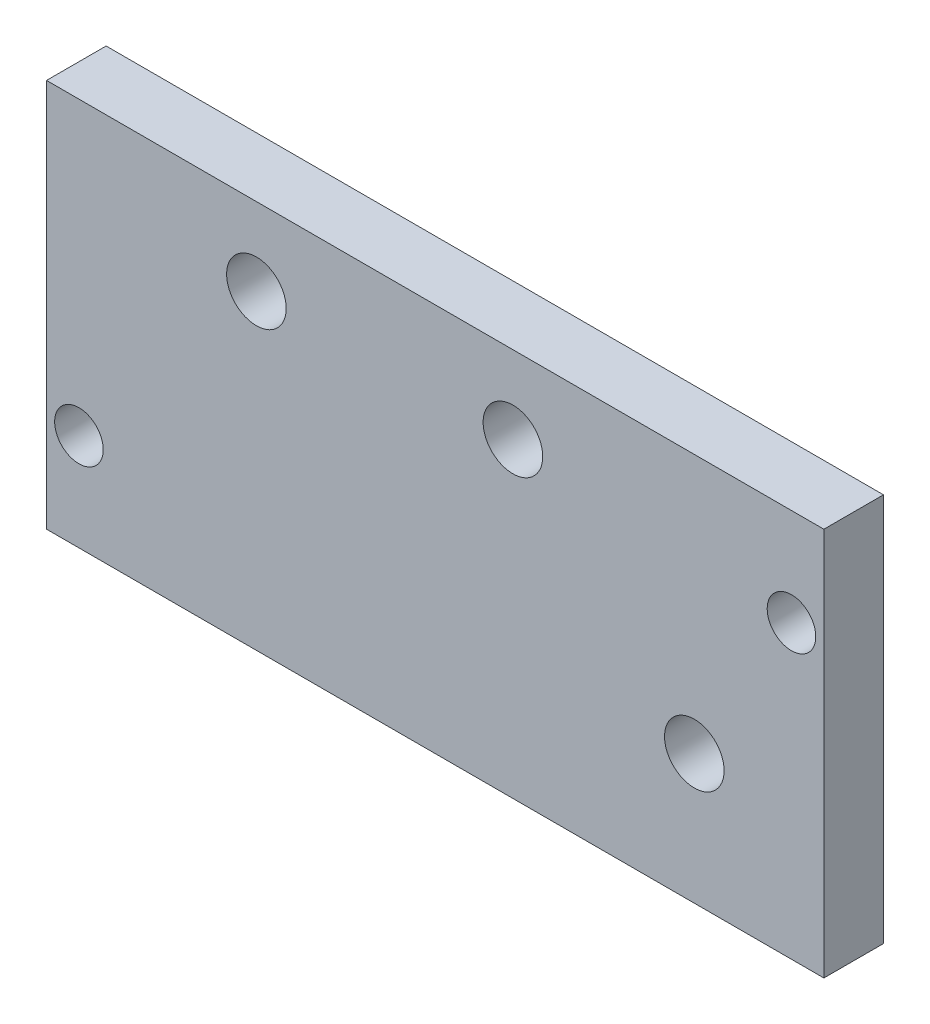
ISO-10303-21;
HEADER;
FILE_DESCRIPTION(('STEP AP214'),'2;1');
FILE_NAME('part.step','',(''),(''),'','','');
FILE_SCHEMA(('AUTOMOTIVE_DESIGN { 1 0 10303 214 1 1 1 1 }'));
ENDSEC;
DATA;
#1=APPLICATION_CONTEXT('core data for automotive mechanical design processes');
#2=APPLICATION_PROTOCOL_DEFINITION('international standard','automotive_design',2000,#1);
#3=PRODUCT_CONTEXT('',#1,'mechanical');
#4=PRODUCT('Part','Part','',(#3));
#5=PRODUCT_RELATED_PRODUCT_CATEGORY('part','',(#4));
#6=PRODUCT_DEFINITION_FORMATION('','',#4);
#7=PRODUCT_DEFINITION_CONTEXT('part definition',#1,'design');
#8=PRODUCT_DEFINITION('design','',#6,#7);
#9=PRODUCT_DEFINITION_SHAPE('','',#8);
#10=(LENGTH_UNIT() NAMED_UNIT(*) SI_UNIT(.MILLI.,.METRE.));
#11=(NAMED_UNIT(*) PLANE_ANGLE_UNIT() SI_UNIT($,.RADIAN.));
#12=(NAMED_UNIT(*) SI_UNIT($,.STERADIAN.) SOLID_ANGLE_UNIT());
#13=UNCERTAINTY_MEASURE_WITH_UNIT(LENGTH_MEASURE(1.E-05),#10,'distance_accuracy_value','');
#14=(GEOMETRIC_REPRESENTATION_CONTEXT(3) GLOBAL_UNCERTAINTY_ASSIGNED_CONTEXT((#13)) GLOBAL_UNIT_ASSIGNED_CONTEXT((#10,
#11,#12)) REPRESENTATION_CONTEXT('',''));
#15=CARTESIAN_POINT('',(0.,0.,0.));
#16=DIRECTION('',(0.,0.,1.));
#17=DIRECTION('',(1.,0.,0.));
#18=AXIS2_PLACEMENT_3D('',#15,#16,#17);
#19=CARTESIAN_POINT('',(0.,0.,4.6));
#20=DIRECTION('',(0.,0.,-1.));
#21=DIRECTION('',(-1.,0.,0.));
#22=AXIS2_PLACEMENT_3D('',#19,#20,#21);
#23=PLANE('',#22);
#24=CARTESIAN_POINT('',(-27.5,-7.5,4.6));
#25=DIRECTION('',(0.,0.,-1.));
#26=DIRECTION('',(-1.,0.,0.));
#27=AXIS2_PLACEMENT_3D('',#24,#25,#26);
#28=CIRCLE('',#27,1.875);
#29=CARTESIAN_POINT('',(-29.375,-7.5,4.6));
#30=VERTEX_POINT('',#29);
#31=EDGE_CURVE('E133',#30,#30,#28,.F.);
#32=ORIENTED_EDGE('',*,*,#31,.F.);
#33=EDGE_LOOP('',(#32));
#34=FACE_BOUND('',#33,.T.);
#35=CARTESIAN_POINT('',(27.5,7.5,4.6));
#36=DIRECTION('',(0.,0.,-1.));
#37=DIRECTION('',(-1.,0.,0.));
#38=AXIS2_PLACEMENT_3D('',#35,#36,#37);
#39=CIRCLE('',#38,1.875);
#40=CARTESIAN_POINT('',(25.625,7.5,4.6));
#41=VERTEX_POINT('',#40);
#42=EDGE_CURVE('E138',#41,#41,#39,.F.);
#43=ORIENTED_EDGE('',*,*,#42,.F.);
#44=EDGE_LOOP('',(#43));
#45=FACE_BOUND('',#44,.T.);
#46=DIRECTION('',(0.,1.,0.));
#47=VECTOR('',#46,1.);
#48=CARTESIAN_POINT('',(30.,-15.,4.6));
#49=LINE('',#48,#47);
#50=CARTESIAN_POINT('',(30.,-15.,4.6));
#51=VERTEX_POINT('',#50);
#52=CARTESIAN_POINT('',(30.,15.,4.6));
#53=VERTEX_POINT('',#52);
#54=EDGE_CURVE('E91',#51,#53,#49,.T.);
#55=ORIENTED_EDGE('',*,*,#54,.T.);
#56=DIRECTION('',(-1.,0.,0.));
#57=VECTOR('',#56,1.);
#58=CARTESIAN_POINT('',(-30.,15.,4.6));
#59=LINE('',#58,#57);
#60=CARTESIAN_POINT('',(-30.,15.,4.6));
#61=VERTEX_POINT('',#60);
#62=EDGE_CURVE('E86',#53,#61,#59,.T.);
#63=ORIENTED_EDGE('',*,*,#62,.T.);
#64=DIRECTION('',(0.,-1.,0.));
#65=VECTOR('',#64,1.);
#66=CARTESIAN_POINT('',(-30.,-15.,4.6));
#67=LINE('',#66,#65);
#68=CARTESIAN_POINT('',(-30.,-15.,4.6));
#69=VERTEX_POINT('',#68);
#70=EDGE_CURVE('E89',#61,#69,#67,.T.);
#71=ORIENTED_EDGE('',*,*,#70,.T.);
#72=DIRECTION('',(1.,0.,0.));
#73=VECTOR('',#72,1.);
#74=CARTESIAN_POINT('',(-30.,-15.,4.6));
#75=LINE('',#74,#73);
#76=EDGE_CURVE('E56',#69,#51,#75,.T.);
#77=ORIENTED_EDGE('',*,*,#76,.T.);
#78=EDGE_LOOP('',(#55,#63,#71,#77));
#79=FACE_BOUND('',#78,.T.);
#80=CARTESIAN_POINT('',(-13.8007142674936,9.00071426749366,4.6));
#81=DIRECTION('',(0.,0.,1.));
#82=DIRECTION('',(1.,0.,0.));
#83=AXIS2_PLACEMENT_3D('',#80,#81,#82);
#84=CIRCLE('',#83,2.3);
#85=CARTESIAN_POINT('',(-11.5007142674936,9.00071426749366,4.6));
#86=VERTEX_POINT('',#85);
#87=EDGE_CURVE('E106',#86,#86,#84,.T.);
#88=ORIENTED_EDGE('',*,*,#87,.F.);
#89=EDGE_LOOP('',(#88));
#90=FACE_BOUND('',#89,.T.);
#91=CARTESIAN_POINT('',(5.99928573250638,9.00071426749366,4.6));
#92=DIRECTION('',(0.,0.,1.));
#93=DIRECTION('',(1.,0.,0.));
#94=AXIS2_PLACEMENT_3D('',#91,#92,#93);
#95=CIRCLE('',#94,2.3);
#96=CARTESIAN_POINT('',(8.29928573250638,9.00071426749366,4.6));
#97=VERTEX_POINT('',#96);
#98=EDGE_CURVE('E121',#97,#97,#95,.T.);
#99=ORIENTED_EDGE('',*,*,#98,.F.);
#100=EDGE_LOOP('',(#99));
#101=FACE_BOUND('',#100,.T.);
#102=CARTESIAN_POINT('',(20.,-5.,4.6));
#103=DIRECTION('',(0.,0.,1.));
#104=DIRECTION('',(1.,0.,0.));
#105=AXIS2_PLACEMENT_3D('',#102,#103,#104);
#106=CIRCLE('',#105,2.3);
#107=CARTESIAN_POINT('',(22.3,-5.,4.6));
#108=VERTEX_POINT('',#107);
#109=EDGE_CURVE('E127',#108,#108,#106,.T.);
#110=ORIENTED_EDGE('',*,*,#109,.F.);
#111=EDGE_LOOP('',(#110));
#112=FACE_BOUND('',#111,.T.);
#113=ADVANCED_FACE('F39',(#34,#45,#79,#90,#101,#112),#23,.F.);
#114=CARTESIAN_POINT('',(0.,0.,0.));
#115=DIRECTION('',(0.,0.,-1.));
#116=DIRECTION('',(-1.,0.,0.));
#117=AXIS2_PLACEMENT_3D('',#114,#115,#116);
#118=PLANE('',#117);
#119=CARTESIAN_POINT('',(-27.5,-7.5,0.));
#120=DIRECTION('',(0.,0.,-1.));
#121=DIRECTION('',(-1.,0.,0.));
#122=AXIS2_PLACEMENT_3D('',#119,#120,#121);
#123=CIRCLE('',#122,1.875);
#124=CARTESIAN_POINT('',(-29.375,-7.5,0.));
#125=VERTEX_POINT('',#124);
#126=EDGE_CURVE('E141',#125,#125,#123,.F.);
#127=ORIENTED_EDGE('',*,*,#126,.T.);
#128=EDGE_LOOP('',(#127));
#129=FACE_BOUND('',#128,.T.);
#130=CARTESIAN_POINT('',(27.5,7.5,0.));
#131=DIRECTION('',(0.,0.,-1.));
#132=DIRECTION('',(-1.,0.,0.));
#133=AXIS2_PLACEMENT_3D('',#130,#131,#132);
#134=CIRCLE('',#133,1.875);
#135=CARTESIAN_POINT('',(25.625,7.5,0.));
#136=VERTEX_POINT('',#135);
#137=EDGE_CURVE('E142',#136,#136,#134,.F.);
#138=ORIENTED_EDGE('',*,*,#137,.T.);
#139=EDGE_LOOP('',(#138));
#140=FACE_BOUND('',#139,.T.);
#141=CARTESIAN_POINT('',(5.99928573250638,9.00071426749366,0.));
#142=DIRECTION('',(0.,0.,1.));
#143=DIRECTION('',(1.,0.,0.));
#144=AXIS2_PLACEMENT_3D('',#141,#142,#143);
#145=CIRCLE('',#144,2.3);
#146=CARTESIAN_POINT('',(8.29928573250638,9.00071426749366,0.));
#147=VERTEX_POINT('',#146);
#148=EDGE_CURVE('E124',#147,#147,#145,.T.);
#149=ORIENTED_EDGE('',*,*,#148,.T.);
#150=EDGE_LOOP('',(#149));
#151=FACE_BOUND('',#150,.T.);
#152=DIRECTION('',(0.,1.,0.));
#153=VECTOR('',#152,1.);
#154=CARTESIAN_POINT('',(30.,-15.,0.));
#155=LINE('',#154,#153);
#156=CARTESIAN_POINT('',(30.,-15.,0.));
#157=VERTEX_POINT('',#156);
#158=CARTESIAN_POINT('',(30.,15.,0.));
#159=VERTEX_POINT('',#158);
#160=EDGE_CURVE('E103',#157,#159,#155,.T.);
#161=ORIENTED_EDGE('',*,*,#160,.F.);
#162=DIRECTION('',(1.,0.,0.));
#163=VECTOR('',#162,1.);
#164=CARTESIAN_POINT('',(-30.,-15.,0.));
#165=LINE('',#164,#163);
#166=CARTESIAN_POINT('',(-30.,-15.,0.));
#167=VERTEX_POINT('',#166);
#168=EDGE_CURVE('E79',#167,#157,#165,.T.);
#169=ORIENTED_EDGE('',*,*,#168,.F.);
#170=DIRECTION('',(0.,-1.,0.));
#171=VECTOR('',#170,1.);
#172=CARTESIAN_POINT('',(-30.,-15.,0.));
#173=LINE('',#172,#171);
#174=CARTESIAN_POINT('',(-30.,15.,0.));
#175=VERTEX_POINT('',#174);
#176=EDGE_CURVE('E73',#175,#167,#173,.T.);
#177=ORIENTED_EDGE('',*,*,#176,.F.);
#178=DIRECTION('',(-1.,0.,0.));
#179=VECTOR('',#178,1.);
#180=CARTESIAN_POINT('',(-30.,15.,0.));
#181=LINE('',#180,#179);
#182=EDGE_CURVE('E95',#159,#175,#181,.T.);
#183=ORIENTED_EDGE('',*,*,#182,.F.);
#184=EDGE_LOOP('',(#161,#169,#177,#183));
#185=FACE_BOUND('',#184,.T.);
#186=CARTESIAN_POINT('',(-13.8007142674936,9.00071426749366,0.));
#187=DIRECTION('',(0.,0.,1.));
#188=DIRECTION('',(1.,0.,0.));
#189=AXIS2_PLACEMENT_3D('',#186,#187,#188);
#190=CIRCLE('',#189,2.3);
#191=CARTESIAN_POINT('',(-11.5007142674936,9.00071426749366,0.));
#192=VERTEX_POINT('',#191);
#193=EDGE_CURVE('E118',#192,#192,#190,.T.);
#194=ORIENTED_EDGE('',*,*,#193,.T.);
#195=EDGE_LOOP('',(#194));
#196=FACE_BOUND('',#195,.T.);
#197=CARTESIAN_POINT('',(20.,-5.,0.));
#198=DIRECTION('',(0.,0.,1.));
#199=DIRECTION('',(1.,0.,0.));
#200=AXIS2_PLACEMENT_3D('',#197,#198,#199);
#201=CIRCLE('',#200,2.3);
#202=CARTESIAN_POINT('',(22.3,-5.,0.));
#203=VERTEX_POINT('',#202);
#204=EDGE_CURVE('E130',#203,#203,#201,.T.);
#205=ORIENTED_EDGE('',*,*,#204,.T.);
#206=EDGE_LOOP('',(#205));
#207=FACE_BOUND('',#206,.T.);
#208=ADVANCED_FACE('F114',(#129,#140,#151,#185,#196,#207),#118,.T.);
#209=CARTESIAN_POINT('',(30.,-15.,4.6));
#210=DIRECTION('',(-1.,0.,0.));
#211=DIRECTION('',(0.,0.,1.));
#212=AXIS2_PLACEMENT_3D('',#209,#210,#211);
#213=PLANE('',#212);
#214=ORIENTED_EDGE('',*,*,#160,.T.);
#215=DIRECTION('',(0.,0.,-1.));
#216=VECTOR('',#215,1.);
#217=CARTESIAN_POINT('',(30.,15.,4.6));
#218=LINE('',#217,#216);
#219=EDGE_CURVE('E11',#53,#159,#218,.T.);
#220=ORIENTED_EDGE('',*,*,#219,.F.);
#221=ORIENTED_EDGE('',*,*,#54,.F.);
#222=DIRECTION('',(0.,0.,-1.));
#223=VECTOR('',#222,1.);
#224=CARTESIAN_POINT('',(30.,-15.,4.6));
#225=LINE('',#224,#223);
#226=EDGE_CURVE('E99',#51,#157,#225,.T.);
#227=ORIENTED_EDGE('',*,*,#226,.T.);
#228=EDGE_LOOP('',(#214,#220,#221,#227));
#229=FACE_BOUND('',#228,.T.);
#230=ADVANCED_FACE('F41',(#229),#213,.F.);
#231=CARTESIAN_POINT('',(-30.,15.,4.6));
#232=DIRECTION('',(0.,-1.,0.));
#233=DIRECTION('',(0.,0.,-1.));
#234=AXIS2_PLACEMENT_3D('',#231,#232,#233);
#235=PLANE('',#234);
#236=ORIENTED_EDGE('',*,*,#182,.T.);
#237=DIRECTION('',(0.,0.,-1.));
#238=VECTOR('',#237,1.);
#239=CARTESIAN_POINT('',(-30.,15.,4.6));
#240=LINE('',#239,#238);
#241=EDGE_CURVE('E48',#61,#175,#240,.T.);
#242=ORIENTED_EDGE('',*,*,#241,.F.);
#243=ORIENTED_EDGE('',*,*,#62,.F.);
#244=ORIENTED_EDGE('',*,*,#219,.T.);
#245=EDGE_LOOP('',(#236,#242,#243,#244));
#246=FACE_BOUND('',#245,.T.);
#247=ADVANCED_FACE('F94',(#246),#235,.F.);
#248=CARTESIAN_POINT('',(-30.,-15.,4.6));
#249=DIRECTION('',(1.,0.,0.));
#250=DIRECTION('',(0.,0.,-1.));
#251=AXIS2_PLACEMENT_3D('',#248,#249,#250);
#252=PLANE('',#251);
#253=ORIENTED_EDGE('',*,*,#176,.T.);
#254=DIRECTION('',(0.,0.,-1.));
#255=VECTOR('',#254,1.);
#256=CARTESIAN_POINT('',(-30.,-15.,4.6));
#257=LINE('',#256,#255);
#258=EDGE_CURVE('E96',#69,#167,#257,.T.);
#259=ORIENTED_EDGE('',*,*,#258,.F.);
#260=ORIENTED_EDGE('',*,*,#70,.F.);
#261=ORIENTED_EDGE('',*,*,#241,.T.);
#262=EDGE_LOOP('',(#253,#259,#260,#261));
#263=FACE_BOUND('',#262,.T.);
#264=ADVANCED_FACE('F97',(#263),#252,.F.);
#265=CARTESIAN_POINT('',(-30.,-15.,4.6));
#266=DIRECTION('',(0.,1.,0.));
#267=DIRECTION('',(0.,0.,1.));
#268=AXIS2_PLACEMENT_3D('',#265,#266,#267);
#269=PLANE('',#268);
#270=ORIENTED_EDGE('',*,*,#168,.T.);
#271=ORIENTED_EDGE('',*,*,#226,.F.);
#272=ORIENTED_EDGE('',*,*,#76,.F.);
#273=ORIENTED_EDGE('',*,*,#258,.T.);
#274=EDGE_LOOP('',(#270,#271,#272,#273));
#275=FACE_BOUND('',#274,.T.);
#276=ADVANCED_FACE('F111',(#275),#269,.F.);
#277=CARTESIAN_POINT('',(-13.8007142674936,9.00071426749366,4.6));
#278=DIRECTION('',(0.,0.,-1.));
#279=DIRECTION('',(-1.,0.,0.));
#280=AXIS2_PLACEMENT_3D('',#277,#278,#279);
#281=CYLINDRICAL_SURFACE('',#280,2.3);
#282=ORIENTED_EDGE('',*,*,#87,.T.);
#283=EDGE_LOOP('',(#282));
#284=FACE_BOUND('',#283,.T.);
#285=ORIENTED_EDGE('',*,*,#193,.F.);
#286=EDGE_LOOP('',(#285));
#287=FACE_BOUND('',#286,.T.);
#288=ADVANCED_FACE('F177',(#284,#287),#281,.F.);
#289=CARTESIAN_POINT('',(5.99928573250638,9.00071426749366,4.6));
#290=DIRECTION('',(0.,0.,-1.));
#291=DIRECTION('',(-1.,0.,0.));
#292=AXIS2_PLACEMENT_3D('',#289,#290,#291);
#293=CYLINDRICAL_SURFACE('',#292,2.3);
#294=ORIENTED_EDGE('',*,*,#98,.T.);
#295=EDGE_LOOP('',(#294));
#296=FACE_BOUND('',#295,.T.);
#297=ORIENTED_EDGE('',*,*,#148,.F.);
#298=EDGE_LOOP('',(#297));
#299=FACE_BOUND('',#298,.T.);
#300=ADVANCED_FACE('F170',(#296,#299),#293,.F.);
#301=CARTESIAN_POINT('',(20.,-5.,4.6));
#302=DIRECTION('',(0.,0.,-1.));
#303=DIRECTION('',(-1.,0.,0.));
#304=AXIS2_PLACEMENT_3D('',#301,#302,#303);
#305=CYLINDRICAL_SURFACE('',#304,2.3);
#306=ORIENTED_EDGE('',*,*,#109,.T.);
#307=EDGE_LOOP('',(#306));
#308=FACE_BOUND('',#307,.T.);
#309=ORIENTED_EDGE('',*,*,#204,.F.);
#310=EDGE_LOOP('',(#309));
#311=FACE_BOUND('',#310,.T.);
#312=ADVANCED_FACE('F163',(#308,#311),#305,.F.);
#313=CARTESIAN_POINT('',(27.5,7.5,4.600012));
#314=DIRECTION('',(0.,0.,-1.));
#315=DIRECTION('',(-1.,0.,0.));
#316=AXIS2_PLACEMENT_3D('',#313,#314,#315);
#317=CYLINDRICAL_SURFACE('',#316,1.875);
#318=CARTESIAN_POINT('',(25.625,7.5,0.));
#319=CARTESIAN_POINT('',(25.625,7.5,0.0479166666666665));
#320=CARTESIAN_POINT('',(25.625,7.5,0.0958333333333332));
#321=CARTESIAN_POINT('',(25.625,7.5,0.191666666666667));
#322=CARTESIAN_POINT('',(25.625,7.5,0.239583333333334));
#323=CARTESIAN_POINT('',(25.625,7.5,0.335416666666667));
#324=CARTESIAN_POINT('',(25.625,7.5,0.383333333333334));
#325=CARTESIAN_POINT('',(25.625,7.5,0.479166666666667));
#326=CARTESIAN_POINT('',(25.625,7.5,0.527083333333333));
#327=CARTESIAN_POINT('',(25.625,7.5,0.622916666666667));
#328=CARTESIAN_POINT('',(25.625,7.5,0.670833333333333));
#329=CARTESIAN_POINT('',(25.625,7.5,0.766666666666666));
#330=CARTESIAN_POINT('',(25.625,7.5,0.814583333333333));
#331=CARTESIAN_POINT('',(25.625,7.5,0.910416666666667));
#332=CARTESIAN_POINT('',(25.625,7.5,0.958333333333333));
#333=CARTESIAN_POINT('',(25.625,7.5,1.05416666666667));
#334=CARTESIAN_POINT('',(25.625,7.5,1.10208333333333));
#335=CARTESIAN_POINT('',(25.625,7.5,1.19791666666667));
#336=CARTESIAN_POINT('',(25.625,7.5,1.24583333333333));
#337=CARTESIAN_POINT('',(25.625,7.5,1.34166666666667));
#338=CARTESIAN_POINT('',(25.625,7.5,1.38958333333333));
#339=CARTESIAN_POINT('',(25.625,7.5,1.48541666666667));
#340=CARTESIAN_POINT('',(25.625,7.5,1.53333333333333));
#341=CARTESIAN_POINT('',(25.625,7.5,1.62916666666667));
#342=CARTESIAN_POINT('',(25.625,7.5,1.67708333333333));
#343=CARTESIAN_POINT('',(25.625,7.5,1.77291666666667));
#344=CARTESIAN_POINT('',(25.625,7.5,1.82083333333333));
#345=CARTESIAN_POINT('',(25.625,7.5,1.91666666666667));
#346=CARTESIAN_POINT('',(25.625,7.5,1.96458333333333));
#347=CARTESIAN_POINT('',(25.625,7.5,2.06041666666667));
#348=CARTESIAN_POINT('',(25.625,7.5,2.10833333333333));
#349=CARTESIAN_POINT('',(25.625,7.5,2.20416666666667));
#350=CARTESIAN_POINT('',(25.625,7.5,2.25208333333333));
#351=CARTESIAN_POINT('',(25.625,7.5,2.34791666666667));
#352=CARTESIAN_POINT('',(25.625,7.5,2.39583333333333));
#353=CARTESIAN_POINT('',(25.625,7.5,2.49166666666667));
#354=CARTESIAN_POINT('',(25.625,7.5,2.53958333333333));
#355=CARTESIAN_POINT('',(25.625,7.5,2.63541666666667));
#356=CARTESIAN_POINT('',(25.625,7.5,2.68333333333333));
#357=CARTESIAN_POINT('',(25.625,7.5,2.77916666666667));
#358=CARTESIAN_POINT('',(25.625,7.5,2.82708333333333));
#359=CARTESIAN_POINT('',(25.625,7.5,2.92291666666667));
#360=CARTESIAN_POINT('',(25.625,7.5,2.97083333333333));
#361=CARTESIAN_POINT('',(25.625,7.5,3.06666666666667));
#362=CARTESIAN_POINT('',(25.625,7.5,3.11458333333333));
#363=CARTESIAN_POINT('',(25.625,7.5,3.21041666666667));
#364=CARTESIAN_POINT('',(25.625,7.5,3.25833333333333));
#365=CARTESIAN_POINT('',(25.625,7.5,3.35416666666667));
#366=CARTESIAN_POINT('',(25.625,7.5,3.40208333333333));
#367=CARTESIAN_POINT('',(25.625,7.5,3.49791666666667));
#368=CARTESIAN_POINT('',(25.625,7.5,3.54583333333333));
#369=CARTESIAN_POINT('',(25.625,7.5,3.64166666666667));
#370=CARTESIAN_POINT('',(25.625,7.5,3.68958333333333));
#371=CARTESIAN_POINT('',(25.625,7.5,3.78541666666667));
#372=CARTESIAN_POINT('',(25.625,7.5,3.83333333333333));
#373=CARTESIAN_POINT('',(25.625,7.5,3.92916666666667));
#374=CARTESIAN_POINT('',(25.625,7.5,3.97708333333333));
#375=CARTESIAN_POINT('',(25.625,7.5,4.07291666666667));
#376=CARTESIAN_POINT('',(25.625,7.5,4.12083333333333));
#377=CARTESIAN_POINT('',(25.625,7.5,4.21666666666667));
#378=CARTESIAN_POINT('',(25.625,7.5,4.26458333333333));
#379=CARTESIAN_POINT('',(25.625,7.5,4.36041666666667));
#380=CARTESIAN_POINT('',(25.625,7.5,4.40833333333333));
#381=CARTESIAN_POINT('',(25.625,7.5,4.50416666666667));
#382=CARTESIAN_POINT('',(25.625,7.5,4.55208333333333));
#383=CARTESIAN_POINT('',(25.625,7.5,4.6));
#384=B_SPLINE_CURVE_WITH_KNOTS('',3,(#318,#319,#320,#321,#322,#323,#324,#325,#326,#327,#328,
#329,#330,#331,#332,#333,#334,#335,#336,#337,#338,#339,#340,#341,#342,#343,#344,#345,#346,#347,
#348,#349,#350,#351,#352,#353,#354,#355,#356,#357,#358,#359,#360,#361,#362,#363,#364,#365,#366,
#367,#368,#369,#370,#371,#372,#373,#374,#375,#376,#377,#378,#379,#380,#381,#382,#383),
.UNSPECIFIED.,.F.,.F.,(4,2,2,2,2,2,2,2,2,2,2,2,2,2,2,2,2,2,2,2,2,2,2,2,2,2,2,2,2,2,2,2,4),(0.,
0.14375,0.2875,0.43125,0.575,0.71875,0.8625,1.00625,1.15,1.29375,1.4375,1.58125,1.725,1.86875,
2.0125,2.15625,2.3,2.44375,2.5875,2.73125,2.875,3.01875,3.1625,3.30625,3.45,3.59375,3.7375,
3.88125,4.025,4.16875,4.3125,4.45625,4.6),.UNSPECIFIED.);
#385=EDGE_CURVE('BSEAM153',#136,#41,#384,.T.);
#386=ORIENTED_EDGE('',*,*,#137,.F.);
#387=ORIENTED_EDGE('',*,*,#42,.T.);
#388=ORIENTED_EDGE('',*,*,#385,.T.);
#389=ORIENTED_EDGE('',*,*,#385,.F.);
#390=EDGE_LOOP('',(#386,#388,#387,#389));
#391=FACE_BOUND('',#390,.T.);
#392=ADVANCED_FACE('F153',(#391),#317,.F.);
#393=CARTESIAN_POINT('',(-27.5,-7.5,4.600012));
#394=DIRECTION('',(0.,0.,-1.));
#395=DIRECTION('',(-1.,0.,0.));
#396=AXIS2_PLACEMENT_3D('',#393,#394,#395);
#397=CYLINDRICAL_SURFACE('',#396,1.875);
#398=CARTESIAN_POINT('',(-29.375,-7.5,0.));
#399=CARTESIAN_POINT('',(-29.375,-7.5,0.0479166666666665));
#400=CARTESIAN_POINT('',(-29.375,-7.5,0.0958333333333332));
#401=CARTESIAN_POINT('',(-29.375,-7.5,0.191666666666667));
#402=CARTESIAN_POINT('',(-29.375,-7.5,0.239583333333334));
#403=CARTESIAN_POINT('',(-29.375,-7.5,0.335416666666667));
#404=CARTESIAN_POINT('',(-29.375,-7.5,0.383333333333334));
#405=CARTESIAN_POINT('',(-29.375,-7.5,0.479166666666667));
#406=CARTESIAN_POINT('',(-29.375,-7.5,0.527083333333333));
#407=CARTESIAN_POINT('',(-29.375,-7.5,0.622916666666667));
#408=CARTESIAN_POINT('',(-29.375,-7.5,0.670833333333333));
#409=CARTESIAN_POINT('',(-29.375,-7.5,0.766666666666666));
#410=CARTESIAN_POINT('',(-29.375,-7.5,0.814583333333333));
#411=CARTESIAN_POINT('',(-29.375,-7.5,0.910416666666667));
#412=CARTESIAN_POINT('',(-29.375,-7.5,0.958333333333333));
#413=CARTESIAN_POINT('',(-29.375,-7.5,1.05416666666667));
#414=CARTESIAN_POINT('',(-29.375,-7.5,1.10208333333333));
#415=CARTESIAN_POINT('',(-29.375,-7.5,1.19791666666667));
#416=CARTESIAN_POINT('',(-29.375,-7.5,1.24583333333333));
#417=CARTESIAN_POINT('',(-29.375,-7.5,1.34166666666667));
#418=CARTESIAN_POINT('',(-29.375,-7.5,1.38958333333333));
#419=CARTESIAN_POINT('',(-29.375,-7.5,1.48541666666667));
#420=CARTESIAN_POINT('',(-29.375,-7.5,1.53333333333333));
#421=CARTESIAN_POINT('',(-29.375,-7.5,1.62916666666667));
#422=CARTESIAN_POINT('',(-29.375,-7.5,1.67708333333333));
#423=CARTESIAN_POINT('',(-29.375,-7.5,1.77291666666667));
#424=CARTESIAN_POINT('',(-29.375,-7.5,1.82083333333333));
#425=CARTESIAN_POINT('',(-29.375,-7.5,1.91666666666667));
#426=CARTESIAN_POINT('',(-29.375,-7.5,1.96458333333333));
#427=CARTESIAN_POINT('',(-29.375,-7.5,2.06041666666667));
#428=CARTESIAN_POINT('',(-29.375,-7.5,2.10833333333333));
#429=CARTESIAN_POINT('',(-29.375,-7.5,2.20416666666667));
#430=CARTESIAN_POINT('',(-29.375,-7.5,2.25208333333333));
#431=CARTESIAN_POINT('',(-29.375,-7.5,2.34791666666667));
#432=CARTESIAN_POINT('',(-29.375,-7.5,2.39583333333333));
#433=CARTESIAN_POINT('',(-29.375,-7.5,2.49166666666667));
#434=CARTESIAN_POINT('',(-29.375,-7.5,2.53958333333333));
#435=CARTESIAN_POINT('',(-29.375,-7.5,2.63541666666667));
#436=CARTESIAN_POINT('',(-29.375,-7.5,2.68333333333333));
#437=CARTESIAN_POINT('',(-29.375,-7.5,2.77916666666667));
#438=CARTESIAN_POINT('',(-29.375,-7.5,2.82708333333333));
#439=CARTESIAN_POINT('',(-29.375,-7.5,2.92291666666667));
#440=CARTESIAN_POINT('',(-29.375,-7.5,2.97083333333333));
#441=CARTESIAN_POINT('',(-29.375,-7.5,3.06666666666667));
#442=CARTESIAN_POINT('',(-29.375,-7.5,3.11458333333333));
#443=CARTESIAN_POINT('',(-29.375,-7.5,3.21041666666667));
#444=CARTESIAN_POINT('',(-29.375,-7.5,3.25833333333333));
#445=CARTESIAN_POINT('',(-29.375,-7.5,3.35416666666667));
#446=CARTESIAN_POINT('',(-29.375,-7.5,3.40208333333333));
#447=CARTESIAN_POINT('',(-29.375,-7.5,3.49791666666667));
#448=CARTESIAN_POINT('',(-29.375,-7.5,3.54583333333333));
#449=CARTESIAN_POINT('',(-29.375,-7.5,3.64166666666667));
#450=CARTESIAN_POINT('',(-29.375,-7.5,3.68958333333333));
#451=CARTESIAN_POINT('',(-29.375,-7.5,3.78541666666667));
#452=CARTESIAN_POINT('',(-29.375,-7.5,3.83333333333333));
#453=CARTESIAN_POINT('',(-29.375,-7.5,3.92916666666667));
#454=CARTESIAN_POINT('',(-29.375,-7.5,3.97708333333333));
#455=CARTESIAN_POINT('',(-29.375,-7.5,4.07291666666667));
#456=CARTESIAN_POINT('',(-29.375,-7.5,4.12083333333333));
#457=CARTESIAN_POINT('',(-29.375,-7.5,4.21666666666667));
#458=CARTESIAN_POINT('',(-29.375,-7.5,4.26458333333333));
#459=CARTESIAN_POINT('',(-29.375,-7.5,4.36041666666667));
#460=CARTESIAN_POINT('',(-29.375,-7.5,4.40833333333333));
#461=CARTESIAN_POINT('',(-29.375,-7.5,4.50416666666667));
#462=CARTESIAN_POINT('',(-29.375,-7.5,4.55208333333333));
#463=CARTESIAN_POINT('',(-29.375,-7.5,4.6));
#464=B_SPLINE_CURVE_WITH_KNOTS('',3,(#398,#399,#400,#401,#402,#403,#404,#405,#406,#407,#408,
#409,#410,#411,#412,#413,#414,#415,#416,#417,#418,#419,#420,#421,#422,#423,#424,#425,#426,#427,
#428,#429,#430,#431,#432,#433,#434,#435,#436,#437,#438,#439,#440,#441,#442,#443,#444,#445,#446,
#447,#448,#449,#450,#451,#452,#453,#454,#455,#456,#457,#458,#459,#460,#461,#462,#463),
.UNSPECIFIED.,.F.,.F.,(4,2,2,2,2,2,2,2,2,2,2,2,2,2,2,2,2,2,2,2,2,2,2,2,2,2,2,2,2,2,2,2,4),(0.,
0.14375,0.2875,0.43125,0.575,0.71875,0.8625,1.00625,1.15,1.29375,1.4375,1.58125,1.725,1.86875,
2.0125,2.15625,2.3,2.44375,2.5875,2.73125,2.875,3.01875,3.1625,3.30625,3.45,3.59375,3.7375,
3.88125,4.025,4.16875,4.3125,4.45625,4.6),.UNSPECIFIED.);
#465=EDGE_CURVE('BSEAM150',#125,#30,#464,.T.);
#466=ORIENTED_EDGE('',*,*,#126,.F.);
#467=ORIENTED_EDGE('',*,*,#31,.T.);
#468=ORIENTED_EDGE('',*,*,#465,.T.);
#469=ORIENTED_EDGE('',*,*,#465,.F.);
#470=EDGE_LOOP('',(#466,#468,#467,#469));
#471=FACE_BOUND('',#470,.T.);
#472=ADVANCED_FACE('F150',(#471),#397,.F.);
#473=CLOSED_SHELL('',(#113,#208,#230,#247,#264,#276,#288,#300,#312,#392,#472));
#474=MANIFOLD_SOLID_BREP('B2',#473);
#475=ADVANCED_BREP_SHAPE_REPRESENTATION('',(#18,#474),#14);
#476=SHAPE_DEFINITION_REPRESENTATION(#9,#475);
ENDSEC;
END-ISO-10303-21;
